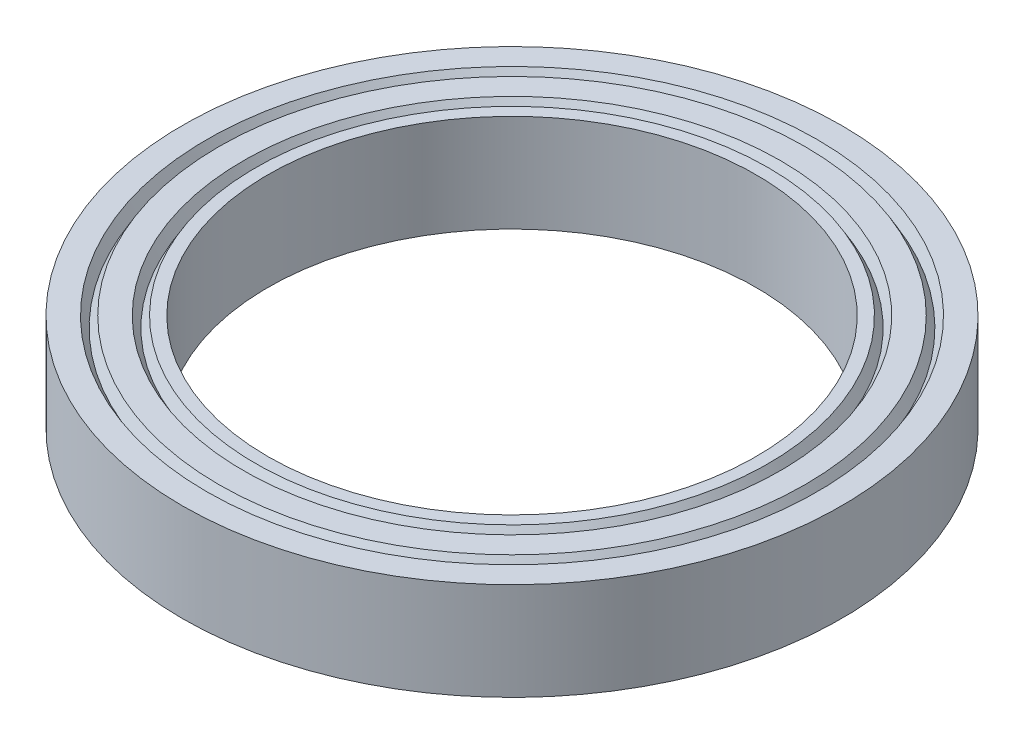
ISO-10303-21;
HEADER;
FILE_DESCRIPTION(('STEP AP214'),'2;1');
FILE_NAME('part.step','',(''),(''),'','','');
FILE_SCHEMA(('AUTOMOTIVE_DESIGN { 1 0 10303 214 1 1 1 1 }'));
ENDSEC;
DATA;
#1=APPLICATION_CONTEXT('core data for automotive mechanical design processes');
#2=APPLICATION_PROTOCOL_DEFINITION('international standard','automotive_design',2000,#1);
#3=PRODUCT_CONTEXT('',#1,'mechanical');
#4=PRODUCT('Part','Part','',(#3));
#5=PRODUCT_RELATED_PRODUCT_CATEGORY('part','',(#4));
#6=PRODUCT_DEFINITION_FORMATION('','',#4);
#7=PRODUCT_DEFINITION_CONTEXT('part definition',#1,'design');
#8=PRODUCT_DEFINITION('design','',#6,#7);
#9=PRODUCT_DEFINITION_SHAPE('','',#8);
#10=(LENGTH_UNIT() NAMED_UNIT(*) SI_UNIT(.MILLI.,.METRE.));
#11=(NAMED_UNIT(*) PLANE_ANGLE_UNIT() SI_UNIT($,.RADIAN.));
#12=(NAMED_UNIT(*) SI_UNIT($,.STERADIAN.) SOLID_ANGLE_UNIT());
#13=UNCERTAINTY_MEASURE_WITH_UNIT(LENGTH_MEASURE(1.E-05),#10,'distance_accuracy_value','');
#14=(GEOMETRIC_REPRESENTATION_CONTEXT(3) GLOBAL_UNCERTAINTY_ASSIGNED_CONTEXT((#13)) GLOBAL_UNIT_ASSIGNED_CONTEXT((#10,
#11,#12)) REPRESENTATION_CONTEXT('',''));
#15=CARTESIAN_POINT('',(0.,0.,0.));
#16=DIRECTION('',(0.,0.,1.));
#17=DIRECTION('',(1.,0.,0.));
#18=AXIS2_PLACEMENT_3D('',#15,#16,#17);
#19=CARTESIAN_POINT('',(0.,0.,0.));
#20=DIRECTION('',(0.,1.,0.));
#21=DIRECTION('',(0.,0.,1.));
#22=AXIS2_PLACEMENT_3D('',#19,#20,#21);
#23=PLANE('',#22);
#24=CARTESIAN_POINT('',(0.,0.,0.));
#25=DIRECTION('',(0.,-1.,0.));
#26=DIRECTION('',(0.,0.,-1.));
#27=AXIS2_PLACEMENT_3D('',#24,#25,#26);
#28=CIRCLE('',#27,10.5);
#29=CARTESIAN_POINT('',(0.,0.,-10.5));
#30=VERTEX_POINT('',#29);
#31=EDGE_CURVE('E77',#30,#30,#28,.T.);
#32=ORIENTED_EDGE('',*,*,#31,.T.);
#33=EDGE_LOOP('',(#32));
#34=FACE_BOUND('',#33,.T.);
#35=CARTESIAN_POINT('',(0.,0.,0.));
#36=DIRECTION('',(0.,1.,0.));
#37=DIRECTION('',(0.,0.,1.));
#38=AXIS2_PLACEMENT_3D('',#35,#36,#37);
#39=CIRCLE('',#38,10.);
#40=CARTESIAN_POINT('',(0.,0.,10.));
#41=VERTEX_POINT('',#40);
#42=EDGE_CURVE('E45',#41,#41,#39,.T.);
#43=ORIENTED_EDGE('',*,*,#42,.T.);
#44=EDGE_LOOP('',(#43));
#45=FACE_BOUND('',#44,.T.);
#46=ADVANCED_FACE('F32',(#34,#45),#23,.F.);
#47=CARTESIAN_POINT('',(0.,4.,0.));
#48=DIRECTION('',(0.,1.,0.));
#49=DIRECTION('',(0.,0.,1.));
#50=AXIS2_PLACEMENT_3D('',#47,#48,#49);
#51=PLANE('',#50);
#52=CARTESIAN_POINT('',(0.,4.,0.));
#53=DIRECTION('',(0.,-1.,0.));
#54=DIRECTION('',(0.,0.,-1.));
#55=AXIS2_PLACEMENT_3D('',#52,#53,#54);
#56=CIRCLE('',#55,10.5);
#57=CARTESIAN_POINT('',(0.,4.,-10.5));
#58=VERTEX_POINT('',#57);
#59=EDGE_CURVE('E59',#58,#58,#56,.T.);
#60=ORIENTED_EDGE('',*,*,#59,.F.);
#61=EDGE_LOOP('',(#60));
#62=FACE_BOUND('',#61,.T.);
#63=CARTESIAN_POINT('',(0.,4.,0.));
#64=DIRECTION('',(0.,1.,0.));
#65=DIRECTION('',(0.,0.,1.));
#66=AXIS2_PLACEMENT_3D('',#63,#64,#65);
#67=CIRCLE('',#66,10.);
#68=CARTESIAN_POINT('',(0.,4.,10.));
#69=VERTEX_POINT('',#68);
#70=EDGE_CURVE('E43',#69,#69,#67,.T.);
#71=ORIENTED_EDGE('',*,*,#70,.F.);
#72=EDGE_LOOP('',(#71));
#73=FACE_BOUND('',#72,.T.);
#74=ADVANCED_FACE('F129',(#62,#73),#51,.T.);
#75=CARTESIAN_POINT('',(0.,4.,0.));
#76=DIRECTION('',(0.,-1.,0.));
#77=DIRECTION('',(0.,0.,-1.));
#78=AXIS2_PLACEMENT_3D('',#75,#76,#77);
#79=CIRCLE('',#78,12.5);
#80=CARTESIAN_POINT('',(0.,4.,-12.5));
#81=VERTEX_POINT('',#80);
#82=EDGE_CURVE('E53',#81,#81,#79,.T.);
#83=ORIENTED_EDGE('',*,*,#82,.T.);
#84=EDGE_LOOP('',(#83));
#85=FACE_BOUND('',#84,.T.);
#86=CARTESIAN_POINT('',(0.,4.,0.));
#87=DIRECTION('',(0.,1.,0.));
#88=DIRECTION('',(0.,0.,1.));
#89=AXIS2_PLACEMENT_3D('',#86,#87,#88);
#90=CIRCLE('',#89,13.5);
#91=CARTESIAN_POINT('',(0.,4.,13.5));
#92=VERTEX_POINT('',#91);
#93=EDGE_CURVE('E10',#92,#92,#90,.T.);
#94=ORIENTED_EDGE('',*,*,#93,.T.);
#95=EDGE_LOOP('',(#94));
#96=FACE_BOUND('',#95,.T.);
#97=ADVANCED_FACE('F116',(#85,#96),#51,.T.);
#98=CARTESIAN_POINT('',(0.,0.,0.));
#99=DIRECTION('',(0.,-1.,0.));
#100=DIRECTION('',(0.,0.,-1.));
#101=AXIS2_PLACEMENT_3D('',#98,#99,#100);
#102=CIRCLE('',#101,12.5);
#103=CARTESIAN_POINT('',(0.,0.,-12.5));
#104=VERTEX_POINT('',#103);
#105=EDGE_CURVE('E71',#104,#104,#102,.T.);
#106=ORIENTED_EDGE('',*,*,#105,.F.);
#107=EDGE_LOOP('',(#106));
#108=FACE_BOUND('',#107,.T.);
#109=CARTESIAN_POINT('',(0.,0.,0.));
#110=DIRECTION('',(0.,1.,0.));
#111=DIRECTION('',(0.,0.,1.));
#112=AXIS2_PLACEMENT_3D('',#109,#110,#111);
#113=CIRCLE('',#112,13.5);
#114=CARTESIAN_POINT('',(0.,0.,13.5));
#115=VERTEX_POINT('',#114);
#116=EDGE_CURVE('E36',#115,#115,#113,.T.);
#117=ORIENTED_EDGE('',*,*,#116,.F.);
#118=EDGE_LOOP('',(#117));
#119=FACE_BOUND('',#118,.T.);
#120=ADVANCED_FACE('F99',(#108,#119),#23,.F.);
#121=CARTESIAN_POINT('',(0.,4.,0.));
#122=DIRECTION('',(0.,-1.,0.));
#123=DIRECTION('',(0.,0.,-1.));
#124=AXIS2_PLACEMENT_3D('',#121,#122,#123);
#125=CYLINDRICAL_SURFACE('',#124,13.5);
#126=ORIENTED_EDGE('',*,*,#93,.F.);
#127=EDGE_LOOP('',(#126));
#128=FACE_BOUND('',#127,.T.);
#129=ORIENTED_EDGE('',*,*,#116,.T.);
#130=EDGE_LOOP('',(#129));
#131=FACE_BOUND('',#130,.T.);
#132=ADVANCED_FACE('F34',(#128,#131),#125,.T.);
#133=CARTESIAN_POINT('',(0.,4.,0.));
#134=DIRECTION('',(0.,-1.,0.));
#135=DIRECTION('',(0.,0.,-1.));
#136=AXIS2_PLACEMENT_3D('',#133,#134,#135);
#137=CYLINDRICAL_SURFACE('',#136,10.);
#138=ORIENTED_EDGE('',*,*,#70,.T.);
#139=EDGE_LOOP('',(#138));
#140=FACE_BOUND('',#139,.T.);
#141=ORIENTED_EDGE('',*,*,#42,.F.);
#142=EDGE_LOOP('',(#141));
#143=FACE_BOUND('',#142,.T.);
#144=ADVANCED_FACE('F120',(#140,#143),#137,.F.);
#145=CARTESIAN_POINT('',(0.,3.56698729810778,0.));
#146=DIRECTION('',(0.,-1.,0.));
#147=DIRECTION('',(0.,0.,-1.));
#148=AXIS2_PLACEMENT_3D('',#145,#146,#147);
#149=CONICAL_SURFACE('',#148,12.25,0.523598775598301);
#150=CARTESIAN_POINT('',(0.,4.,0.));
#151=DIRECTION('',(0.,-1.,0.));
#152=DIRECTION('',(0.,0.,-1.));
#153=AXIS2_PLACEMENT_3D('',#150,#151,#152);
#154=CIRCLE('',#153,12.);
#155=CARTESIAN_POINT('',(0.,4.,-12.));
#156=VERTEX_POINT('',#155);
#157=EDGE_CURVE('E48',#156,#156,#154,.T.);
#158=ORIENTED_EDGE('',*,*,#157,.T.);
#159=EDGE_LOOP('',(#158));
#160=FACE_BOUND('',#159,.T.);
#161=CARTESIAN_POINT('',(0.,3.56698729810778,0.));
#162=DIRECTION('',(0.,-1.,0.));
#163=DIRECTION('',(0.,0.,-1.));
#164=AXIS2_PLACEMENT_3D('',#161,#162,#163);
#165=CIRCLE('',#164,12.25);
#166=CARTESIAN_POINT('',(0.,3.56698729810778,-12.25));
#167=VERTEX_POINT('',#166);
#168=EDGE_CURVE('E56',#167,#167,#165,.T.);
#169=ORIENTED_EDGE('',*,*,#168,.F.);
#170=EDGE_LOOP('',(#169));
#171=FACE_BOUND('',#170,.T.);
#172=ADVANCED_FACE('F125',(#160,#171),#149,.T.);
#173=CARTESIAN_POINT('',(0.,4.,0.));
#174=DIRECTION('',(0.,1.,0.));
#175=DIRECTION('',(0.,0.,1.));
#176=AXIS2_PLACEMENT_3D('',#173,#174,#175);
#177=CONICAL_SURFACE('',#176,12.5,0.523598775598289);
#178=ORIENTED_EDGE('',*,*,#168,.T.);
#179=EDGE_LOOP('',(#178));
#180=FACE_BOUND('',#179,.T.);
#181=ORIENTED_EDGE('',*,*,#82,.F.);
#182=EDGE_LOOP('',(#181));
#183=FACE_BOUND('',#182,.T.);
#184=ADVANCED_FACE('F143',(#180,#183),#177,.F.);
#185=CARTESIAN_POINT('',(0.,4.,0.));
#186=DIRECTION('',(0.,-1.,0.));
#187=DIRECTION('',(0.,0.,-1.));
#188=AXIS2_PLACEMENT_3D('',#185,#186,#187);
#189=CIRCLE('',#188,11.);
#190=CARTESIAN_POINT('',(0.,4.,-11.));
#191=VERTEX_POINT('',#190);
#192=EDGE_CURVE('E62',#191,#191,#189,.T.);
#193=ORIENTED_EDGE('',*,*,#192,.T.);
#194=EDGE_LOOP('',(#193));
#195=FACE_BOUND('',#194,.T.);
#196=ORIENTED_EDGE('',*,*,#157,.F.);
#197=EDGE_LOOP('',(#196));
#198=FACE_BOUND('',#197,.T.);
#199=ADVANCED_FACE('F136',(#195,#198),#51,.T.);
#200=CARTESIAN_POINT('',(0.,3.56698729810778,0.));
#201=DIRECTION('',(0.,-1.,0.));
#202=DIRECTION('',(0.,0.,-1.));
#203=AXIS2_PLACEMENT_3D('',#200,#201,#202);
#204=CONICAL_SURFACE('',#203,10.75,0.523598775598295);
#205=ORIENTED_EDGE('',*,*,#59,.T.);
#206=EDGE_LOOP('',(#205));
#207=FACE_BOUND('',#206,.T.);
#208=CARTESIAN_POINT('',(0.,3.56698729810778,0.));
#209=DIRECTION('',(0.,-1.,0.));
#210=DIRECTION('',(0.,0.,-1.));
#211=AXIS2_PLACEMENT_3D('',#208,#209,#210);
#212=CIRCLE('',#211,10.75);
#213=CARTESIAN_POINT('',(0.,3.56698729810778,-10.75));
#214=VERTEX_POINT('',#213);
#215=EDGE_CURVE('E65',#214,#214,#212,.T.);
#216=ORIENTED_EDGE('',*,*,#215,.F.);
#217=EDGE_LOOP('',(#216));
#218=FACE_BOUND('',#217,.T.);
#219=ADVANCED_FACE('F148',(#207,#218),#204,.T.);
#220=CARTESIAN_POINT('',(0.,4.,0.));
#221=DIRECTION('',(0.,1.,0.));
#222=DIRECTION('',(0.,0.,1.));
#223=AXIS2_PLACEMENT_3D('',#220,#221,#222);
#224=CONICAL_SURFACE('',#223,11.,0.523598775598289);
#225=ORIENTED_EDGE('',*,*,#215,.T.);
#226=EDGE_LOOP('',(#225));
#227=FACE_BOUND('',#226,.T.);
#228=ORIENTED_EDGE('',*,*,#192,.F.);
#229=EDGE_LOOP('',(#228));
#230=FACE_BOUND('',#229,.T.);
#231=ADVANCED_FACE('F105',(#227,#230),#224,.F.);
#232=CARTESIAN_POINT('',(0.,0.433012701892223,0.));
#233=DIRECTION('',(0.,1.,0.));
#234=DIRECTION('',(0.,0.,-1.));
#235=AXIS2_PLACEMENT_3D('',#232,#233,#234);
#236=CONICAL_SURFACE('',#235,12.25,0.523598775598301);
#237=CARTESIAN_POINT('',(0.,0.,0.));
#238=DIRECTION('',(0.,-1.,0.));
#239=DIRECTION('',(0.,0.,-1.));
#240=AXIS2_PLACEMENT_3D('',#237,#238,#239);
#241=CIRCLE('',#240,12.);
#242=CARTESIAN_POINT('',(0.,0.,-12.));
#243=VERTEX_POINT('',#242);
#244=EDGE_CURVE('E68',#243,#243,#241,.T.);
#245=ORIENTED_EDGE('',*,*,#244,.F.);
#246=EDGE_LOOP('',(#245));
#247=FACE_BOUND('',#246,.T.);
#248=CARTESIAN_POINT('',(0.,0.433012701892223,0.));
#249=DIRECTION('',(0.,-1.,0.));
#250=DIRECTION('',(0.,0.,-1.));
#251=AXIS2_PLACEMENT_3D('',#248,#249,#250);
#252=CIRCLE('',#251,12.25);
#253=CARTESIAN_POINT('',(0.,0.433012701892223,-12.25));
#254=VERTEX_POINT('',#253);
#255=EDGE_CURVE('E74',#254,#254,#252,.T.);
#256=ORIENTED_EDGE('',*,*,#255,.T.);
#257=EDGE_LOOP('',(#256));
#258=FACE_BOUND('',#257,.T.);
#259=ADVANCED_FACE('F102',(#247,#258),#236,.T.);
#260=CARTESIAN_POINT('',(0.,0.,0.));
#261=DIRECTION('',(0.,-1.,0.));
#262=DIRECTION('',(0.,0.,1.));
#263=AXIS2_PLACEMENT_3D('',#260,#261,#262);
#264=CONICAL_SURFACE('',#263,12.5,0.523598775598289);
#265=ORIENTED_EDGE('',*,*,#255,.F.);
#266=EDGE_LOOP('',(#265));
#267=FACE_BOUND('',#266,.T.);
#268=ORIENTED_EDGE('',*,*,#105,.T.);
#269=EDGE_LOOP('',(#268));
#270=FACE_BOUND('',#269,.T.);
#271=ADVANCED_FACE('F98',(#267,#270),#264,.F.);
#272=CARTESIAN_POINT('',(0.,0.,0.));
#273=DIRECTION('',(0.,-1.,0.));
#274=DIRECTION('',(0.,0.,-1.));
#275=AXIS2_PLACEMENT_3D('',#272,#273,#274);
#276=CIRCLE('',#275,11.);
#277=CARTESIAN_POINT('',(0.,0.,-11.));
#278=VERTEX_POINT('',#277);
#279=EDGE_CURVE('E80',#278,#278,#276,.T.);
#280=ORIENTED_EDGE('',*,*,#279,.F.);
#281=EDGE_LOOP('',(#280));
#282=FACE_BOUND('',#281,.T.);
#283=ORIENTED_EDGE('',*,*,#244,.T.);
#284=EDGE_LOOP('',(#283));
#285=FACE_BOUND('',#284,.T.);
#286=ADVANCED_FACE('F95',(#282,#285),#23,.F.);
#287=CARTESIAN_POINT('',(0.,0.433012701892224,0.));
#288=DIRECTION('',(0.,1.,0.));
#289=DIRECTION('',(0.,0.,-1.));
#290=AXIS2_PLACEMENT_3D('',#287,#288,#289);
#291=CONICAL_SURFACE('',#290,10.75,0.523598775598295);
#292=ORIENTED_EDGE('',*,*,#31,.F.);
#293=EDGE_LOOP('',(#292));
#294=FACE_BOUND('',#293,.T.);
#295=CARTESIAN_POINT('',(0.,0.433012701892224,0.));
#296=DIRECTION('',(0.,-1.,0.));
#297=DIRECTION('',(0.,0.,-1.));
#298=AXIS2_PLACEMENT_3D('',#295,#296,#297);
#299=CIRCLE('',#298,10.75);
#300=CARTESIAN_POINT('',(0.,0.433012701892224,-10.75));
#301=VERTEX_POINT('',#300);
#302=EDGE_CURVE('E83',#301,#301,#299,.T.);
#303=ORIENTED_EDGE('',*,*,#302,.T.);
#304=EDGE_LOOP('',(#303));
#305=FACE_BOUND('',#304,.T.);
#306=ADVANCED_FACE('F87',(#294,#305),#291,.T.);
#307=CARTESIAN_POINT('',(0.,0.,0.));
#308=DIRECTION('',(0.,-1.,0.));
#309=DIRECTION('',(0.,0.,1.));
#310=AXIS2_PLACEMENT_3D('',#307,#308,#309);
#311=CONICAL_SURFACE('',#310,11.,0.523598775598289);
#312=ORIENTED_EDGE('',*,*,#302,.F.);
#313=EDGE_LOOP('',(#312));
#314=FACE_BOUND('',#313,.T.);
#315=ORIENTED_EDGE('',*,*,#279,.T.);
#316=EDGE_LOOP('',(#315));
#317=FACE_BOUND('',#316,.T.);
#318=ADVANCED_FACE('F89',(#314,#317),#311,.F.);
#319=CLOSED_SHELL('',(#46,#74,#97,#120,#132,#144,#172,#184,#199,#219,#231,#259,#271,#286,#306,#318));
#320=MANIFOLD_SOLID_BREP('B2',#319);
#321=ADVANCED_BREP_SHAPE_REPRESENTATION('',(#18,#320),#14);
#322=SHAPE_DEFINITION_REPRESENTATION(#9,#321);
ENDSEC;
END-ISO-10303-21;
